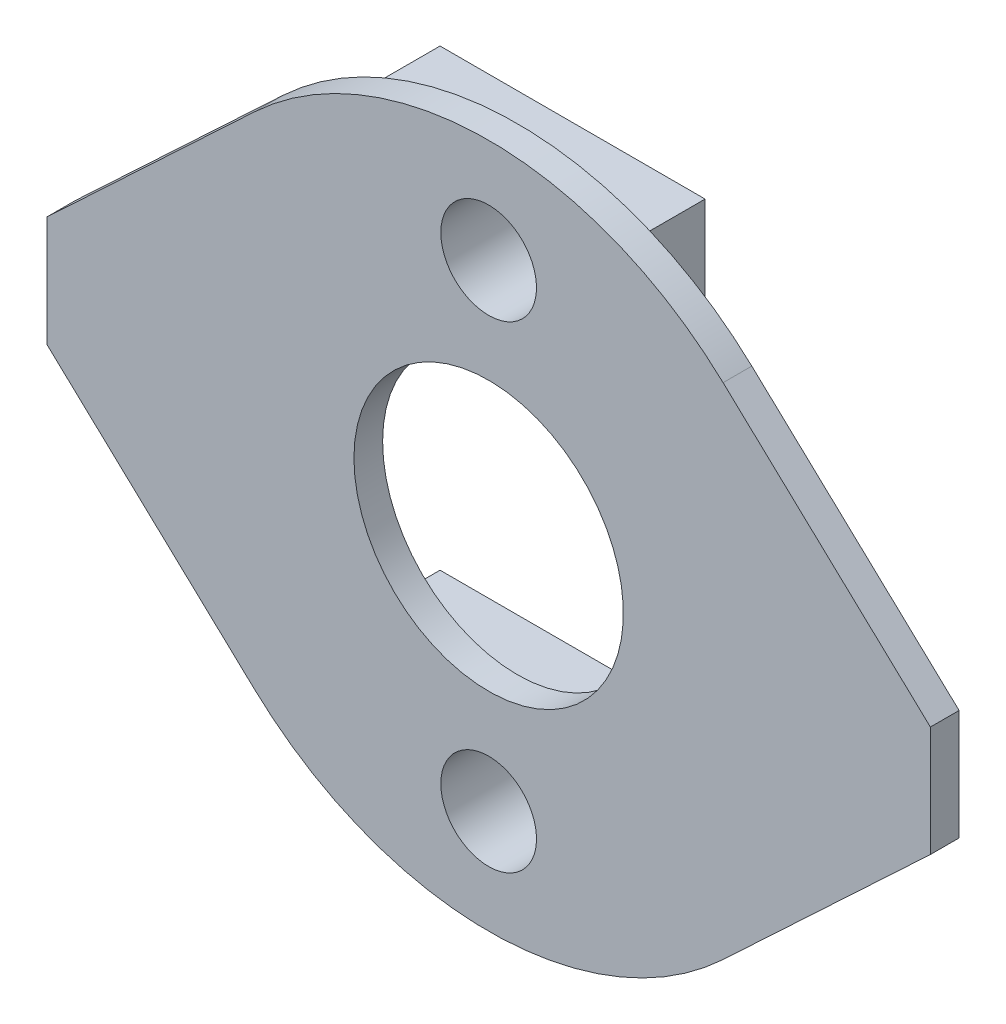
ISO-10303-21;
HEADER;
FILE_DESCRIPTION(('STEP AP214'),'2;1');
FILE_NAME('part.step','',(''),(''),'','','');
FILE_SCHEMA(('AUTOMOTIVE_DESIGN { 1 0 10303 214 1 1 1 1 }'));
ENDSEC;
DATA;
#1=APPLICATION_CONTEXT('core data for automotive mechanical design processes');
#2=APPLICATION_PROTOCOL_DEFINITION('international standard','automotive_design',2000,#1);
#3=PRODUCT_CONTEXT('',#1,'mechanical');
#4=PRODUCT('Part','Part','',(#3));
#5=PRODUCT_RELATED_PRODUCT_CATEGORY('part','',(#4));
#6=PRODUCT_DEFINITION_FORMATION('','',#4);
#7=PRODUCT_DEFINITION_CONTEXT('part definition',#1,'design');
#8=PRODUCT_DEFINITION('design','',#6,#7);
#9=PRODUCT_DEFINITION_SHAPE('','',#8);
#10=(LENGTH_UNIT() NAMED_UNIT(*) SI_UNIT(.MILLI.,.METRE.));
#11=(NAMED_UNIT(*) PLANE_ANGLE_UNIT() SI_UNIT($,.RADIAN.));
#12=(NAMED_UNIT(*) SI_UNIT($,.STERADIAN.) SOLID_ANGLE_UNIT());
#13=UNCERTAINTY_MEASURE_WITH_UNIT(LENGTH_MEASURE(1.E-05),#10,'distance_accuracy_value','');
#14=(GEOMETRIC_REPRESENTATION_CONTEXT(3) GLOBAL_UNCERTAINTY_ASSIGNED_CONTEXT((#13)) GLOBAL_UNIT_ASSIGNED_CONTEXT((#10,
#11,#12)) REPRESENTATION_CONTEXT('',''));
#15=CARTESIAN_POINT('',(0.,0.,0.));
#16=DIRECTION('',(0.,0.,1.));
#17=DIRECTION('',(1.,0.,0.));
#18=AXIS2_PLACEMENT_3D('',#15,#16,#17);
#19=CARTESIAN_POINT('',(0.,0.,0.));
#20=DIRECTION('',(0.,0.,1.));
#21=DIRECTION('',(1.,0.,0.));
#22=AXIS2_PLACEMENT_3D('',#19,#20,#21);
#23=PLANE('',#22);
#24=CARTESIAN_POINT('',(57.1500000000004,9.54764330165096,0.));
#25=DIRECTION('',(0.,0.,1.));
#26=DIRECTION('',(1.,0.,0.));
#27=AXIS2_PLACEMENT_3D('',#24,#25,#26);
#28=CIRCLE('',#27,7.74699999999999);
#29=CARTESIAN_POINT('',(64.8970000000004,9.54764330165096,0.));
#30=VERTEX_POINT('',#29);
#31=EDGE_CURVE('E239',#30,#30,#28,.T.);
#32=ORIENTED_EDGE('',*,*,#31,.T.);
#33=EDGE_LOOP('',(#32));
#34=FACE_BOUND('',#33,.T.);
#35=CARTESIAN_POINT('',(57.1500000000004,9.54764330165096,0.));
#36=DIRECTION('',(0.,0.,1.));
#37=DIRECTION('',(1.,0.,0.));
#38=AXIS2_PLACEMENT_3D('',#35,#36,#37);
#39=CIRCLE('',#38,19.6976671665307);
#40=CARTESIAN_POINT('',(49.5300000000007,27.7117202615029,0.));
#41=VERTEX_POINT('',#40);
#42=CARTESIAN_POINT('',(43.6698010908684,23.9101754312462,0.));
#43=VERTEX_POINT('',#42);
#44=EDGE_CURVE('E257',#41,#43,#39,.T.);
#45=ORIENTED_EDGE('',*,*,#44,.F.);
#46=DIRECTION('',(0.,-1.,0.));
#47=VECTOR('',#46,1.);
#48=CARTESIAN_POINT('',(49.5300000000002,0.,0.));
#49=LINE('',#48,#47);
#50=CARTESIAN_POINT('',(49.5300000000002,17.485143301651,0.));
#51=VERTEX_POINT('',#50);
#52=EDGE_CURVE('E166',#41,#51,#49,.T.);
#53=ORIENTED_EDGE('',*,*,#52,.T.);
#54=DIRECTION('',(-1.,0.,0.));
#55=VECTOR('',#54,1.);
#56=CARTESIAN_POINT('',(0.,17.485143301651,0.));
#57=LINE('',#56,#55);
#58=CARTESIAN_POINT('',(64.7700000000002,17.485143301651,0.));
#59=VERTEX_POINT('',#58);
#60=EDGE_CURVE('E182',#59,#51,#57,.T.);
#61=ORIENTED_EDGE('',*,*,#60,.F.);
#62=DIRECTION('',(0.,-1.,0.));
#63=VECTOR('',#62,1.);
#64=CARTESIAN_POINT('',(64.7700000000002,0.,0.));
#65=LINE('',#64,#63);
#66=CARTESIAN_POINT('',(64.7700000000002,27.7117202615029,0.));
#67=VERTEX_POINT('',#66);
#68=EDGE_CURVE('E199',#67,#59,#65,.T.);
#69=ORIENTED_EDGE('',*,*,#68,.F.);
#70=CARTESIAN_POINT('',(70.6301989091325,23.9101754312462,0.));
#71=VERTEX_POINT('',#70);
#72=EDGE_CURVE('E252',#71,#67,#39,.T.);
#73=ORIENTED_EDGE('',*,*,#72,.F.);
#74=DIRECTION('',(-0.729148888960789,0.684355096223625,0.));
#75=VECTOR('',#74,1.);
#76=CARTESIAN_POINT('',(45.0101814189399,47.9562787720065,0.));
#77=LINE('',#76,#75);
#78=CARTESIAN_POINT('',(82.5500000000005,12.722643301651,0.));
#79=VERTEX_POINT('',#78);
#80=EDGE_CURVE('E258',#79,#71,#77,.T.);
#81=ORIENTED_EDGE('',*,*,#80,.F.);
#82=DIRECTION('',(0.,-1.,0.));
#83=VECTOR('',#82,1.);
#84=CARTESIAN_POINT('',(82.5500000000005,0.,0.));
#85=LINE('',#84,#83);
#86=CARTESIAN_POINT('',(82.5500000000005,6.37264330165097,0.));
#87=VERTEX_POINT('',#86);
#88=EDGE_CURVE('E251',#79,#87,#85,.T.);
#89=ORIENTED_EDGE('',*,*,#88,.T.);
#90=DIRECTION('',(-0.729148888960788,-0.684355096223626,0.));
#91=VECTOR('',#90,1.);
#92=CARTESIAN_POINT('',(35.4816953095491,-37.8041149341407,0.));
#93=LINE('',#92,#91);
#94=CARTESIAN_POINT('',(70.6301989091325,-4.81488882794428,0.));
#95=VERTEX_POINT('',#94);
#96=EDGE_CURVE('E243',#87,#95,#93,.T.);
#97=ORIENTED_EDGE('',*,*,#96,.T.);
#98=CARTESIAN_POINT('',(57.1500000000004,9.54764330165096,0.));
#99=DIRECTION('',(0.,0.,1.));
#100=DIRECTION('',(1.,0.,0.));
#101=AXIS2_PLACEMENT_3D('',#98,#99,#100);
#102=CIRCLE('',#101,19.6976671665307);
#103=CARTESIAN_POINT('',(64.7700000000002,-8.61643365820099,0.));
#104=VERTEX_POINT('',#103);
#105=EDGE_CURVE('E272',#104,#95,#102,.T.);
#106=ORIENTED_EDGE('',*,*,#105,.F.);
#107=DIRECTION('',(0.,1.,0.));
#108=VECTOR('',#107,1.);
#109=CARTESIAN_POINT('',(64.7700000000002,0.,0.));
#110=LINE('',#109,#108);
#111=CARTESIAN_POINT('',(64.7700000000002,1.61014330165096,0.));
#112=VERTEX_POINT('',#111);
#113=EDGE_CURVE('E63',#104,#112,#110,.T.);
#114=ORIENTED_EDGE('',*,*,#113,.T.);
#115=DIRECTION('',(-1.,0.,0.));
#116=VECTOR('',#115,1.);
#117=CARTESIAN_POINT('',(0.,1.61014330165096,0.));
#118=LINE('',#117,#116);
#119=CARTESIAN_POINT('',(49.5300000000002,1.61014330165096,0.));
#120=VERTEX_POINT('',#119);
#121=EDGE_CURVE('E227',#112,#120,#118,.T.);
#122=ORIENTED_EDGE('',*,*,#121,.T.);
#123=DIRECTION('',(0.,1.,0.));
#124=VECTOR('',#123,1.);
#125=CARTESIAN_POINT('',(49.5300000000002,0.,0.));
#126=LINE('',#125,#124);
#127=CARTESIAN_POINT('',(49.5300000000002,-8.61643365820078,0.));
#128=VERTEX_POINT('',#127);
#129=EDGE_CURVE('E224',#128,#120,#126,.T.);
#130=ORIENTED_EDGE('',*,*,#129,.F.);
#131=CARTESIAN_POINT('',(43.6698010908684,-4.81488882794428,0.));
#132=VERTEX_POINT('',#131);
#133=EDGE_CURVE('E267',#132,#128,#102,.T.);
#134=ORIENTED_EDGE('',*,*,#133,.F.);
#135=DIRECTION('',(0.729148888960788,-0.684355096223626,0.));
#136=VECTOR('',#135,1.);
#137=CARTESIAN_POINT('',(18.0497836006758,19.2312145128161,0.));
#138=LINE('',#137,#136);
#139=CARTESIAN_POINT('',(31.7500000000003,6.37264330165096,0.));
#140=VERTEX_POINT('',#139);
#141=EDGE_CURVE('E273',#140,#132,#138,.T.);
#142=ORIENTED_EDGE('',*,*,#141,.F.);
#143=DIRECTION('',(0.,-1.,0.));
#144=VECTOR('',#143,1.);
#145=CARTESIAN_POINT('',(31.7500000000003,1.04083408558609E-13,0.));
#146=LINE('',#145,#144);
#147=CARTESIAN_POINT('',(31.7500000000003,12.722643301651,0.));
#148=VERTEX_POINT('',#147);
#149=EDGE_CURVE('E244',#148,#140,#146,.T.);
#150=ORIENTED_EDGE('',*,*,#149,.F.);
#151=DIRECTION('',(0.729148888960789,0.684355096223625,0.));
#152=VECTOR('',#151,1.);
#153=CARTESIAN_POINT('',(8.52129749128487,-9.07905067495022,0.));
#154=LINE('',#153,#152);
#155=EDGE_CURVE('E247',#148,#43,#154,.T.);
#156=ORIENTED_EDGE('',*,*,#155,.T.);
#157=EDGE_LOOP('',(#45,#53,#61,#69,#73,#81,#89,#97,#106,#114,#122,#130,#134,#142,#150,#156));
#158=FACE_BOUND('',#157,.T.);
#159=ADVANCED_FACE('F46',(#34,#158),#23,.F.);
#160=DIRECTION('',(-1.,0.,0.));
#161=VECTOR('',#160,1.);
#162=CARTESIAN_POINT('',(0.,-8.616433658201,0.));
#163=LINE('',#162,#161);
#164=EDGE_CURVE('E70',#104,#128,#163,.T.);
#165=ORIENTED_EDGE('',*,*,#164,.F.);
#166=EDGE_CURVE('E271',#128,#104,#102,.T.);
#167=ORIENTED_EDGE('',*,*,#166,.F.);
#168=EDGE_LOOP('',(#165,#167));
#169=FACE_BOUND('',#168,.T.);
#170=ADVANCED_FACE('F373',(#169),#23,.F.);
#171=CARTESIAN_POINT('',(18.0497836006758,19.2312145128161,65.9355533320956));
#172=DIRECTION('',(0.684355096223626,0.729148888960788,0.));
#173=DIRECTION('',(-0.729148888960788,0.684355096223626,0.));
#174=AXIS2_PLACEMENT_3D('',#171,#172,#173);
#175=PLANE('',#174);
#176=DIRECTION('',(0.,0.,-1.));
#177=VECTOR('',#176,1.);
#178=CARTESIAN_POINT('',(43.6698010908684,-4.81488882794428,65.9355533320956));
#179=LINE('',#178,#177);
#180=CARTESIAN_POINT('',(43.6698010908684,-4.81488882794428,1.65));
#181=VERTEX_POINT('',#180);
#182=EDGE_CURVE('E278',#181,#132,#179,.T.);
#183=ORIENTED_EDGE('',*,*,#182,.F.);
#184=DIRECTION('',(-0.729148888960788,0.684355096223626,0.));
#185=VECTOR('',#184,1.);
#186=CARTESIAN_POINT('',(18.0497836006758,19.2312145128161,1.65));
#187=LINE('',#186,#185);
#188=CARTESIAN_POINT('',(31.7500000000003,6.37264330165096,1.65));
#189=VERTEX_POINT('',#188);
#190=EDGE_CURVE('E171',#181,#189,#187,.T.);
#191=ORIENTED_EDGE('',*,*,#190,.T.);
#192=DIRECTION('',(0.,0.,-1.));
#193=VECTOR('',#192,1.);
#194=CARTESIAN_POINT('',(31.7500000000003,6.37264330165096,65.9355533320956));
#195=LINE('',#194,#193);
#196=EDGE_CURVE('E277',#189,#140,#195,.T.);
#197=ORIENTED_EDGE('',*,*,#196,.T.);
#198=ORIENTED_EDGE('',*,*,#141,.T.);
#199=EDGE_LOOP('',(#183,#191,#197,#198));
#200=FACE_BOUND('',#199,.T.);
#201=ADVANCED_FACE('F318',(#200),#175,.F.);
#202=CARTESIAN_POINT('',(57.1500000000004,9.54764330165096,65.9355533320956));
#203=DIRECTION('',(0.,0.,-1.));
#204=DIRECTION('',(-1.,0.,0.));
#205=AXIS2_PLACEMENT_3D('',#202,#203,#204);
#206=CYLINDRICAL_SURFACE('',#205,19.6976671665307);
#207=DIRECTION('',(0.,0.,-1.));
#208=VECTOR('',#207,1.);
#209=CARTESIAN_POINT('',(70.6301989091325,-4.81488882794428,65.9355533320956));
#210=LINE('',#209,#208);
#211=CARTESIAN_POINT('',(70.6301989091325,-4.81488882794428,1.65));
#212=VERTEX_POINT('',#211);
#213=EDGE_CURVE('E270',#212,#95,#210,.T.);
#214=ORIENTED_EDGE('',*,*,#213,.F.);
#215=CARTESIAN_POINT('',(57.1500000000004,9.54764330165096,1.65));
#216=DIRECTION('',(0.,0.,-1.));
#217=DIRECTION('',(-1.,0.,0.));
#218=AXIS2_PLACEMENT_3D('',#215,#216,#217);
#219=CIRCLE('',#218,19.6976671665307);
#220=EDGE_CURVE('E276',#212,#181,#219,.T.);
#221=ORIENTED_EDGE('',*,*,#220,.T.);
#222=ORIENTED_EDGE('',*,*,#182,.T.);
#223=ORIENTED_EDGE('',*,*,#133,.T.);
#224=ORIENTED_EDGE('',*,*,#166,.T.);
#225=ORIENTED_EDGE('',*,*,#105,.T.);
#226=EDGE_LOOP('',(#214,#221,#222,#223,#224,#225));
#227=FACE_BOUND('',#226,.T.);
#228=ADVANCED_FACE('F323',(#227),#206,.T.);
#229=CARTESIAN_POINT('',(35.4816953095491,-37.8041149341407,65.9355533320956));
#230=DIRECTION('',(0.684355096223626,-0.729148888960788,0.));
#231=DIRECTION('',(0.729148888960788,0.684355096223626,0.));
#232=AXIS2_PLACEMENT_3D('',#229,#230,#231);
#233=PLANE('',#232);
#234=DIRECTION('',(0.729148888960788,0.684355096223626,0.));
#235=VECTOR('',#234,1.);
#236=CARTESIAN_POINT('',(35.4816953095491,-37.8041149341407,1.65));
#237=LINE('',#236,#235);
#238=CARTESIAN_POINT('',(82.5500000000005,6.37264330165097,1.65));
#239=VERTEX_POINT('',#238);
#240=EDGE_CURVE('E302',#212,#239,#237,.T.);
#241=ORIENTED_EDGE('',*,*,#240,.F.);
#242=ORIENTED_EDGE('',*,*,#213,.T.);
#243=ORIENTED_EDGE('',*,*,#96,.F.);
#244=DIRECTION('',(0.,0.,-1.));
#245=VECTOR('',#244,1.);
#246=CARTESIAN_POINT('',(82.5500000000005,6.37264330165097,65.9355533320956));
#247=LINE('',#246,#245);
#248=EDGE_CURVE('E282',#239,#87,#247,.T.);
#249=ORIENTED_EDGE('',*,*,#248,.F.);
#250=EDGE_LOOP('',(#241,#242,#243,#249));
#251=FACE_BOUND('',#250,.T.);
#252=ADVANCED_FACE('F330',(#251),#233,.T.);
#253=CARTESIAN_POINT('',(82.5500000000005,0.,65.9355533320956));
#254=DIRECTION('',(1.,0.,0.));
#255=DIRECTION('',(0.,0.,-1.));
#256=AXIS2_PLACEMENT_3D('',#253,#254,#255);
#257=PLANE('',#256);
#258=DIRECTION('',(0.,1.,0.));
#259=VECTOR('',#258,1.);
#260=CARTESIAN_POINT('',(82.5500000000005,0.,1.65));
#261=LINE('',#260,#259);
#262=CARTESIAN_POINT('',(82.5500000000005,12.722643301651,1.65));
#263=VERTEX_POINT('',#262);
#264=EDGE_CURVE('E55',#239,#263,#261,.T.);
#265=ORIENTED_EDGE('',*,*,#264,.F.);
#266=ORIENTED_EDGE('',*,*,#248,.T.);
#267=ORIENTED_EDGE('',*,*,#88,.F.);
#268=DIRECTION('',(0.,0.,-1.));
#269=VECTOR('',#268,1.);
#270=CARTESIAN_POINT('',(82.5500000000005,12.722643301651,65.9355533320956));
#271=LINE('',#270,#269);
#272=EDGE_CURVE('E262',#263,#79,#271,.T.);
#273=ORIENTED_EDGE('',*,*,#272,.F.);
#274=EDGE_LOOP('',(#265,#266,#267,#273));
#275=FACE_BOUND('',#274,.T.);
#276=ADVANCED_FACE('F333',(#275),#257,.T.);
#277=CARTESIAN_POINT('',(45.0101814189399,47.9562787720065,65.9355533320956));
#278=DIRECTION('',(-0.684355096223625,-0.729148888960789,0.));
#279=DIRECTION('',(0.729148888960789,-0.684355096223625,0.));
#280=AXIS2_PLACEMENT_3D('',#277,#278,#279);
#281=PLANE('',#280);
#282=DIRECTION('',(0.,0.,-1.));
#283=VECTOR('',#282,1.);
#284=CARTESIAN_POINT('',(70.6301989091325,23.9101754312462,65.9355533320956));
#285=LINE('',#284,#283);
#286=CARTESIAN_POINT('',(70.6301989091325,23.9101754312462,1.65));
#287=VERTEX_POINT('',#286);
#288=EDGE_CURVE('E286',#287,#71,#285,.T.);
#289=ORIENTED_EDGE('',*,*,#288,.F.);
#290=DIRECTION('',(0.729148888960789,-0.684355096223625,0.));
#291=VECTOR('',#290,1.);
#292=CARTESIAN_POINT('',(45.0101814189399,47.9562787720065,1.65));
#293=LINE('',#292,#291);
#294=EDGE_CURVE('E284',#287,#263,#293,.T.);
#295=ORIENTED_EDGE('',*,*,#294,.T.);
#296=ORIENTED_EDGE('',*,*,#272,.T.);
#297=ORIENTED_EDGE('',*,*,#80,.T.);
#298=EDGE_LOOP('',(#289,#295,#296,#297));
#299=FACE_BOUND('',#298,.T.);
#300=ADVANCED_FACE('F337',(#299),#281,.F.);
#301=CARTESIAN_POINT('',(57.1500000000004,9.54764330165096,65.9355533320956));
#302=DIRECTION('',(0.,0.,-1.));
#303=DIRECTION('',(-1.,0.,0.));
#304=AXIS2_PLACEMENT_3D('',#301,#302,#303);
#305=CYLINDRICAL_SURFACE('',#304,19.6976671665307);
#306=DIRECTION('',(0.,0.,-1.));
#307=VECTOR('',#306,1.);
#308=CARTESIAN_POINT('',(43.6698010908684,23.9101754312462,65.9355533320956));
#309=LINE('',#308,#307);
#310=CARTESIAN_POINT('',(43.6698010908684,23.9101754312462,1.65));
#311=VERTEX_POINT('',#310);
#312=EDGE_CURVE('E255',#311,#43,#309,.T.);
#313=ORIENTED_EDGE('',*,*,#312,.F.);
#314=CARTESIAN_POINT('',(57.1500000000004,9.54764330165096,1.65));
#315=DIRECTION('',(0.,0.,-1.));
#316=DIRECTION('',(-1.,0.,0.));
#317=AXIS2_PLACEMENT_3D('',#314,#315,#316);
#318=CIRCLE('',#317,19.6976671665307);
#319=EDGE_CURVE('E261',#311,#287,#318,.T.);
#320=ORIENTED_EDGE('',*,*,#319,.T.);
#321=ORIENTED_EDGE('',*,*,#288,.T.);
#322=ORIENTED_EDGE('',*,*,#72,.T.);
#323=EDGE_CURVE('E256',#67,#41,#39,.T.);
#324=ORIENTED_EDGE('',*,*,#323,.T.);
#325=ORIENTED_EDGE('',*,*,#44,.T.);
#326=EDGE_LOOP('',(#313,#320,#321,#322,#324,#325));
#327=FACE_BOUND('',#326,.T.);
#328=ADVANCED_FACE('F340',(#327),#305,.T.);
#329=CARTESIAN_POINT('',(8.52129749128487,-9.07905067495022,65.9355533320956));
#330=DIRECTION('',(-0.684355096223625,0.729148888960789,0.));
#331=DIRECTION('',(-0.729148888960789,-0.684355096223625,0.));
#332=AXIS2_PLACEMENT_3D('',#329,#330,#331);
#333=PLANE('',#332);
#334=DIRECTION('',(-0.729148888960789,-0.684355096223625,0.));
#335=VECTOR('',#334,1.);
#336=CARTESIAN_POINT('',(8.52129749128487,-9.07905067495022,1.65));
#337=LINE('',#336,#335);
#338=CARTESIAN_POINT('',(31.7500000000003,12.722643301651,1.65));
#339=VERTEX_POINT('',#338);
#340=EDGE_CURVE('E12',#311,#339,#337,.T.);
#341=ORIENTED_EDGE('',*,*,#340,.F.);
#342=ORIENTED_EDGE('',*,*,#312,.T.);
#343=ORIENTED_EDGE('',*,*,#155,.F.);
#344=DIRECTION('',(0.,0.,-1.));
#345=VECTOR('',#344,1.);
#346=CARTESIAN_POINT('',(31.7500000000003,12.722643301651,65.9355533320956));
#347=LINE('',#346,#345);
#348=EDGE_CURVE('E248',#339,#148,#347,.T.);
#349=ORIENTED_EDGE('',*,*,#348,.F.);
#350=EDGE_LOOP('',(#341,#342,#343,#349));
#351=FACE_BOUND('',#350,.T.);
#352=ADVANCED_FACE('F345',(#351),#333,.T.);
#353=CARTESIAN_POINT('',(57.1500000000004,-4.17469028161438,65.9355533320956));
#354=DIRECTION('',(0.,0.,-1.));
#355=DIRECTION('',(-1.,0.,0.));
#356=AXIS2_PLACEMENT_3D('',#353,#354,#355);
#357=CYLINDRICAL_SURFACE('',#356,2.75000000000021);
#358=CARTESIAN_POINT('',(57.1500000000004,-4.17469028161438,1.65));
#359=DIRECTION('',(0.,0.,-1.));
#360=DIRECTION('',(-1.,0.,0.));
#361=AXIS2_PLACEMENT_3D('',#358,#359,#360);
#362=CIRCLE('',#361,2.75000000000021);
#363=CARTESIAN_POINT('',(54.4000000000002,-4.17469028161438,1.65));
#364=VERTEX_POINT('',#363);
#365=EDGE_CURVE('E242',#364,#364,#362,.T.);
#366=ORIENTED_EDGE('',*,*,#365,.F.);
#367=EDGE_LOOP('',(#366));
#368=FACE_BOUND('',#367,.T.);
#369=CARTESIAN_POINT('',(57.1500000000004,-4.17469028161438,-3.175));
#370=DIRECTION('',(0.,0.,-1.));
#371=DIRECTION('',(-1.,0.,0.));
#372=AXIS2_PLACEMENT_3D('',#369,#370,#371);
#373=CIRCLE('',#372,2.75000000000021);
#374=CARTESIAN_POINT('',(54.4000000000002,-4.17469028161438,-3.175));
#375=VERTEX_POINT('',#374);
#376=EDGE_CURVE('E208',#375,#375,#373,.F.);
#377=ORIENTED_EDGE('',*,*,#376,.F.);
#378=EDGE_LOOP('',(#377));
#379=FACE_BOUND('',#378,.T.);
#380=ADVANCED_FACE('F510',(#368,#379),#357,.F.);
#381=CARTESIAN_POINT('',(57.1500000000004,9.54764330165096,65.9355533320956));
#382=DIRECTION('',(0.,0.,-1.));
#383=DIRECTION('',(-1.,0.,0.));
#384=AXIS2_PLACEMENT_3D('',#381,#382,#383);
#385=CYLINDRICAL_SURFACE('',#384,7.74699999999999);
#386=CARTESIAN_POINT('',(57.1500000000004,9.54764330165096,1.65));
#387=DIRECTION('',(0.,0.,-1.));
#388=DIRECTION('',(-1.,0.,0.));
#389=AXIS2_PLACEMENT_3D('',#386,#387,#388);
#390=CIRCLE('',#389,7.74699999999999);
#391=CARTESIAN_POINT('',(49.4030000000004,9.54764330165096,1.65));
#392=VERTEX_POINT('',#391);
#393=EDGE_CURVE('E295',#392,#392,#390,.T.);
#394=ORIENTED_EDGE('',*,*,#393,.F.);
#395=EDGE_LOOP('',(#394));
#396=FACE_BOUND('',#395,.T.);
#397=ORIENTED_EDGE('',*,*,#31,.F.);
#398=EDGE_LOOP('',(#397));
#399=FACE_BOUND('',#398,.T.);
#400=ADVANCED_FACE('F502',(#396,#399),#385,.F.);
#401=CARTESIAN_POINT('',(31.7500000000003,1.04083408558609E-13,65.9355533320956));
#402=DIRECTION('',(1.,0.,0.));
#403=DIRECTION('',(0.,1.,0.));
#404=AXIS2_PLACEMENT_3D('',#401,#402,#403);
#405=PLANE('',#404);
#406=ORIENTED_EDGE('',*,*,#196,.F.);
#407=DIRECTION('',(0.,1.,0.));
#408=VECTOR('',#407,1.);
#409=CARTESIAN_POINT('',(31.7500000000003,1.04083408558609E-13,1.65));
#410=LINE('',#409,#408);
#411=EDGE_CURVE('E290',#189,#339,#410,.T.);
#412=ORIENTED_EDGE('',*,*,#411,.T.);
#413=ORIENTED_EDGE('',*,*,#348,.T.);
#414=ORIENTED_EDGE('',*,*,#149,.T.);
#415=EDGE_LOOP('',(#406,#412,#413,#414));
#416=FACE_BOUND('',#415,.T.);
#417=ADVANCED_FACE('F311',(#416),#405,.F.);
#418=CARTESIAN_POINT('',(57.1500000000004,23.2699768849163,65.9355533320956));
#419=DIRECTION('',(0.,0.,-1.));
#420=DIRECTION('',(-1.,0.,0.));
#421=AXIS2_PLACEMENT_3D('',#418,#419,#420);
#422=CYLINDRICAL_SURFACE('',#421,2.75000000000021);
#423=CARTESIAN_POINT('',(57.1500000000004,23.2699768849163,1.65));
#424=DIRECTION('',(0.,0.,-1.));
#425=DIRECTION('',(-1.,0.,0.));
#426=AXIS2_PLACEMENT_3D('',#423,#424,#425);
#427=CIRCLE('',#426,2.75000000000021);
#428=CARTESIAN_POINT('',(54.4000000000002,23.2699768849163,1.65));
#429=VERTEX_POINT('',#428);
#430=EDGE_CURVE('E50',#429,#429,#427,.T.);
#431=ORIENTED_EDGE('',*,*,#430,.F.);
#432=EDGE_LOOP('',(#431));
#433=FACE_BOUND('',#432,.T.);
#434=CARTESIAN_POINT('',(57.1500000000004,23.2699768849163,-3.175));
#435=DIRECTION('',(0.,0.,-1.));
#436=DIRECTION('',(-1.,0.,0.));
#437=AXIS2_PLACEMENT_3D('',#434,#435,#436);
#438=CIRCLE('',#437,2.75000000000021);
#439=CARTESIAN_POINT('',(54.4000000000002,23.2699768849163,-3.175));
#440=VERTEX_POINT('',#439);
#441=EDGE_CURVE('E191',#440,#440,#438,.F.);
#442=ORIENTED_EDGE('',*,*,#441,.F.);
#443=EDGE_LOOP('',(#442));
#444=FACE_BOUND('',#443,.T.);
#445=ADVANCED_FACE('F384',(#433,#444),#422,.F.);
#446=ORIENTED_EDGE('',*,*,#323,.F.);
#447=DIRECTION('',(-1.,0.,0.));
#448=VECTOR('',#447,1.);
#449=CARTESIAN_POINT('',(0.,27.7117202615029,0.));
#450=LINE('',#449,#448);
#451=EDGE_CURVE('E196',#67,#41,#450,.T.);
#452=ORIENTED_EDGE('',*,*,#451,.T.);
#453=EDGE_LOOP('',(#446,#452));
#454=FACE_BOUND('',#453,.T.);
#455=ADVANCED_FACE('F376',(#454),#23,.F.);
#456=CARTESIAN_POINT('',(12.7,133.35,1.65));
#457=DIRECTION('',(0.,0.,-1.));
#458=DIRECTION('',(-1.,0.,0.));
#459=AXIS2_PLACEMENT_3D('',#456,#457,#458);
#460=PLANE('',#459);
#461=ORIENTED_EDGE('',*,*,#365,.T.);
#462=EDGE_LOOP('',(#461));
#463=FACE_BOUND('',#462,.T.);
#464=ORIENTED_EDGE('',*,*,#393,.T.);
#465=EDGE_LOOP('',(#464));
#466=FACE_BOUND('',#465,.T.);
#467=ORIENTED_EDGE('',*,*,#430,.T.);
#468=EDGE_LOOP('',(#467));
#469=FACE_BOUND('',#468,.T.);
#470=ORIENTED_EDGE('',*,*,#220,.F.);
#471=ORIENTED_EDGE('',*,*,#240,.T.);
#472=ORIENTED_EDGE('',*,*,#264,.T.);
#473=ORIENTED_EDGE('',*,*,#294,.F.);
#474=ORIENTED_EDGE('',*,*,#319,.F.);
#475=ORIENTED_EDGE('',*,*,#340,.T.);
#476=ORIENTED_EDGE('',*,*,#411,.F.);
#477=ORIENTED_EDGE('',*,*,#190,.F.);
#478=EDGE_LOOP('',(#470,#471,#472,#473,#474,#475,#476,#477));
#479=FACE_BOUND('',#478,.T.);
#480=ADVANCED_FACE('F48',(#463,#466,#469,#479),#460,.F.);
#481=CARTESIAN_POINT('',(0.,-8.616433658201,-3.175));
#482=DIRECTION('',(0.,1.,0.));
#483=DIRECTION('',(0.,0.,1.));
#484=AXIS2_PLACEMENT_3D('',#481,#482,#483);
#485=PLANE('',#484);
#486=ORIENTED_EDGE('',*,*,#164,.T.);
#487=DIRECTION('',(0.,0.,1.));
#488=VECTOR('',#487,1.);
#489=CARTESIAN_POINT('',(49.5300000000007,-8.616433658201,-3.175));
#490=LINE('',#489,#488);
#491=CARTESIAN_POINT('',(49.5300000000007,-8.616433658201,-3.175));
#492=VERTEX_POINT('',#491);
#493=EDGE_CURVE('E197',#492,#128,#490,.T.);
#494=ORIENTED_EDGE('',*,*,#493,.F.);
#495=DIRECTION('',(-1.,0.,0.));
#496=VECTOR('',#495,1.);
#497=CARTESIAN_POINT('',(0.,-8.616433658201,-3.175));
#498=LINE('',#497,#496);
#499=CARTESIAN_POINT('',(64.7700000000002,-8.616433658201,-3.175));
#500=VERTEX_POINT('',#499);
#501=EDGE_CURVE('E211',#500,#492,#498,.T.);
#502=ORIENTED_EDGE('',*,*,#501,.F.);
#503=DIRECTION('',(0.,0.,1.));
#504=VECTOR('',#503,1.);
#505=CARTESIAN_POINT('',(64.7700000000002,-8.616433658201,-3.175));
#506=LINE('',#505,#504);
#507=EDGE_CURVE('E222',#500,#104,#506,.T.);
#508=ORIENTED_EDGE('',*,*,#507,.T.);
#509=EDGE_LOOP('',(#486,#494,#502,#508));
#510=FACE_BOUND('',#509,.T.);
#511=ADVANCED_FACE('F353',(#510),#485,.F.);
#512=CARTESIAN_POINT('',(49.5300000000002,0.,-3.175));
#513=DIRECTION('',(1.,0.,0.));
#514=DIRECTION('',(0.,0.,-1.));
#515=AXIS2_PLACEMENT_3D('',#512,#513,#514);
#516=PLANE('',#515);
#517=ORIENTED_EDGE('',*,*,#129,.T.);
#518=DIRECTION('',(0.,0.,1.));
#519=VECTOR('',#518,1.);
#520=CARTESIAN_POINT('',(49.5300000000002,1.61014330165096,-3.175));
#521=LINE('',#520,#519);
#522=CARTESIAN_POINT('',(49.5300000000002,1.61014330165096,-3.175));
#523=VERTEX_POINT('',#522);
#524=EDGE_CURVE('E234',#523,#120,#521,.T.);
#525=ORIENTED_EDGE('',*,*,#524,.F.);
#526=DIRECTION('',(0.,1.,0.));
#527=VECTOR('',#526,1.);
#528=CARTESIAN_POINT('',(49.5300000000002,0.,-3.175));
#529=LINE('',#528,#527);
#530=EDGE_CURVE('E214',#492,#523,#529,.T.);
#531=ORIENTED_EDGE('',*,*,#530,.F.);
#532=ORIENTED_EDGE('',*,*,#493,.T.);
#533=EDGE_LOOP('',(#517,#525,#531,#532));
#534=FACE_BOUND('',#533,.T.);
#535=ADVANCED_FACE('F349',(#534),#516,.F.);
#536=CARTESIAN_POINT('',(0.,1.61014330165096,-3.175));
#537=DIRECTION('',(0.,1.,0.));
#538=DIRECTION('',(0.,0.,1.));
#539=AXIS2_PLACEMENT_3D('',#536,#537,#538);
#540=PLANE('',#539);
#541=ORIENTED_EDGE('',*,*,#121,.F.);
#542=DIRECTION('',(0.,0.,1.));
#543=VECTOR('',#542,1.);
#544=CARTESIAN_POINT('',(64.7700000000002,1.61014330165096,-3.175));
#545=LINE('',#544,#543);
#546=CARTESIAN_POINT('',(64.7700000000002,1.61014330165096,-3.175));
#547=VERTEX_POINT('',#546);
#548=EDGE_CURVE('E232',#547,#112,#545,.T.);
#549=ORIENTED_EDGE('',*,*,#548,.F.);
#550=DIRECTION('',(-1.,0.,0.));
#551=VECTOR('',#550,1.);
#552=CARTESIAN_POINT('',(0.,1.61014330165096,-3.175));
#553=LINE('',#552,#551);
#554=EDGE_CURVE('E216',#547,#523,#553,.T.);
#555=ORIENTED_EDGE('',*,*,#554,.T.);
#556=ORIENTED_EDGE('',*,*,#524,.T.);
#557=EDGE_LOOP('',(#541,#549,#555,#556));
#558=FACE_BOUND('',#557,.T.);
#559=ADVANCED_FACE('F360',(#558),#540,.T.);
#560=CARTESIAN_POINT('',(64.7700000000002,0.,-3.175));
#561=DIRECTION('',(1.,0.,0.));
#562=DIRECTION('',(0.,0.,-1.));
#563=AXIS2_PLACEMENT_3D('',#560,#561,#562);
#564=PLANE('',#563);
#565=ORIENTED_EDGE('',*,*,#113,.F.);
#566=ORIENTED_EDGE('',*,*,#507,.F.);
#567=DIRECTION('',(0.,1.,0.));
#568=VECTOR('',#567,1.);
#569=CARTESIAN_POINT('',(64.7700000000002,0.,-3.175));
#570=LINE('',#569,#568);
#571=EDGE_CURVE('E219',#500,#547,#570,.T.);
#572=ORIENTED_EDGE('',*,*,#571,.T.);
#573=ORIENTED_EDGE('',*,*,#548,.T.);
#574=EDGE_LOOP('',(#565,#566,#572,#573));
#575=FACE_BOUND('',#574,.T.);
#576=ADVANCED_FACE('F356',(#575),#564,.T.);
#577=CARTESIAN_POINT('',(0.,0.,-3.175));
#578=DIRECTION('',(0.,0.,-1.));
#579=DIRECTION('',(-1.,0.,0.));
#580=AXIS2_PLACEMENT_3D('',#577,#578,#579);
#581=PLANE('',#580);
#582=ORIENTED_EDGE('',*,*,#376,.T.);
#583=EDGE_LOOP('',(#582));
#584=FACE_BOUND('',#583,.T.);
#585=ORIENTED_EDGE('',*,*,#501,.T.);
#586=ORIENTED_EDGE('',*,*,#530,.T.);
#587=ORIENTED_EDGE('',*,*,#554,.F.);
#588=ORIENTED_EDGE('',*,*,#571,.F.);
#589=EDGE_LOOP('',(#585,#586,#587,#588));
#590=FACE_BOUND('',#589,.T.);
#591=ADVANCED_FACE('F362',(#584,#590),#581,.T.);
#592=CARTESIAN_POINT('',(49.5300000000002,0.,-3.175));
#593=DIRECTION('',(-1.,0.,0.));
#594=DIRECTION('',(0.,0.,1.));
#595=AXIS2_PLACEMENT_3D('',#592,#593,#594);
#596=PLANE('',#595);
#597=ORIENTED_EDGE('',*,*,#52,.F.);
#598=DIRECTION('',(0.,0.,1.));
#599=VECTOR('',#598,1.);
#600=CARTESIAN_POINT('',(49.5300000000007,27.7117202615029,-3.175));
#601=LINE('',#600,#599);
#602=CARTESIAN_POINT('',(49.5300000000007,27.7117202615029,-3.175));
#603=VERTEX_POINT('',#602);
#604=EDGE_CURVE('E161',#603,#41,#601,.T.);
#605=ORIENTED_EDGE('',*,*,#604,.F.);
#606=DIRECTION('',(0.,-1.,0.));
#607=VECTOR('',#606,1.);
#608=CARTESIAN_POINT('',(49.5300000000002,0.,-3.175));
#609=LINE('',#608,#607);
#610=CARTESIAN_POINT('',(49.5300000000002,17.485143301651,-3.175));
#611=VERTEX_POINT('',#610);
#612=EDGE_CURVE('E164',#603,#611,#609,.T.);
#613=ORIENTED_EDGE('',*,*,#612,.T.);
#614=DIRECTION('',(0.,0.,1.));
#615=VECTOR('',#614,1.);
#616=CARTESIAN_POINT('',(49.5300000000002,17.485143301651,-3.175));
#617=LINE('',#616,#615);
#618=EDGE_CURVE('E194',#611,#51,#617,.T.);
#619=ORIENTED_EDGE('',*,*,#618,.T.);
#620=EDGE_LOOP('',(#597,#605,#613,#619));
#621=FACE_BOUND('',#620,.T.);
#622=ADVANCED_FACE('F163',(#621),#596,.T.);
#623=CARTESIAN_POINT('',(0.,27.7117202615029,-3.175));
#624=DIRECTION('',(0.,1.,0.));
#625=DIRECTION('',(0.,0.,1.));
#626=AXIS2_PLACEMENT_3D('',#623,#624,#625);
#627=PLANE('',#626);
#628=ORIENTED_EDGE('',*,*,#451,.F.);
#629=DIRECTION('',(0.,0.,1.));
#630=VECTOR('',#629,1.);
#631=CARTESIAN_POINT('',(64.7700000000002,27.7117202615029,-3.175));
#632=LINE('',#631,#630);
#633=CARTESIAN_POINT('',(64.7700000000002,27.7117202615029,-3.175));
#634=VERTEX_POINT('',#633);
#635=EDGE_CURVE('E172',#634,#67,#632,.T.);
#636=ORIENTED_EDGE('',*,*,#635,.F.);
#637=DIRECTION('',(-1.,0.,0.));
#638=VECTOR('',#637,1.);
#639=CARTESIAN_POINT('',(0.,27.7117202615029,-3.175));
#640=LINE('',#639,#638);
#641=EDGE_CURVE('E178',#634,#603,#640,.T.);
#642=ORIENTED_EDGE('',*,*,#641,.T.);
#643=ORIENTED_EDGE('',*,*,#604,.T.);
#644=EDGE_LOOP('',(#628,#636,#642,#643));
#645=FACE_BOUND('',#644,.T.);
#646=ADVANCED_FACE('F184',(#645),#627,.T.);
#647=CARTESIAN_POINT('',(64.7700000000002,0.,-3.175));
#648=DIRECTION('',(-1.,0.,0.));
#649=DIRECTION('',(0.,-1.,0.));
#650=AXIS2_PLACEMENT_3D('',#647,#648,#649);
#651=PLANE('',#650);
#652=ORIENTED_EDGE('',*,*,#68,.T.);
#653=DIRECTION('',(0.,0.,1.));
#654=VECTOR('',#653,1.);
#655=CARTESIAN_POINT('',(64.7700000000002,17.485143301651,-3.175));
#656=LINE('',#655,#654);
#657=CARTESIAN_POINT('',(64.7700000000002,17.485143301651,-3.175));
#658=VERTEX_POINT('',#657);
#659=EDGE_CURVE('E204',#658,#59,#656,.T.);
#660=ORIENTED_EDGE('',*,*,#659,.F.);
#661=DIRECTION('',(0.,-1.,0.));
#662=VECTOR('',#661,1.);
#663=CARTESIAN_POINT('',(64.7700000000002,0.,-3.175));
#664=LINE('',#663,#662);
#665=EDGE_CURVE('E186',#634,#658,#664,.T.);
#666=ORIENTED_EDGE('',*,*,#665,.F.);
#667=ORIENTED_EDGE('',*,*,#635,.T.);
#668=EDGE_LOOP('',(#652,#660,#666,#667));
#669=FACE_BOUND('',#668,.T.);
#670=ADVANCED_FACE('F398',(#669),#651,.F.);
#671=CARTESIAN_POINT('',(0.,17.485143301651,-3.175));
#672=DIRECTION('',(0.,1.,0.));
#673=DIRECTION('',(0.,0.,1.));
#674=AXIS2_PLACEMENT_3D('',#671,#672,#673);
#675=PLANE('',#674);
#676=ORIENTED_EDGE('',*,*,#60,.T.);
#677=ORIENTED_EDGE('',*,*,#618,.F.);
#678=DIRECTION('',(-1.,0.,0.));
#679=VECTOR('',#678,1.);
#680=CARTESIAN_POINT('',(0.,17.485143301651,-3.175));
#681=LINE('',#680,#679);
#682=EDGE_CURVE('E180',#658,#611,#681,.T.);
#683=ORIENTED_EDGE('',*,*,#682,.F.);
#684=ORIENTED_EDGE('',*,*,#659,.T.);
#685=EDGE_LOOP('',(#676,#677,#683,#684));
#686=FACE_BOUND('',#685,.T.);
#687=ADVANCED_FACE('F400',(#686),#675,.F.);
#688=CARTESIAN_POINT('',(0.,0.,-3.175));
#689=DIRECTION('',(0.,0.,-1.));
#690=DIRECTION('',(-1.,0.,0.));
#691=AXIS2_PLACEMENT_3D('',#688,#689,#690);
#692=PLANE('',#691);
#693=ORIENTED_EDGE('',*,*,#612,.F.);
#694=ORIENTED_EDGE('',*,*,#641,.F.);
#695=ORIENTED_EDGE('',*,*,#665,.T.);
#696=ORIENTED_EDGE('',*,*,#682,.T.);
#697=EDGE_LOOP('',(#693,#694,#695,#696));
#698=FACE_BOUND('',#697,.T.);
#699=ORIENTED_EDGE('',*,*,#441,.T.);
#700=EDGE_LOOP('',(#699));
#701=FACE_BOUND('',#700,.T.);
#702=ADVANCED_FACE('F176',(#698,#701),#692,.T.);
#703=CLOSED_SHELL('',(#159,#170,#201,#228,#252,#276,#300,#328,#352,#380,#400,#417,#445,#455,
#480,#511,#535,#559,#576,#591,#622,#646,#670,#687,#702));
#704=MANIFOLD_SOLID_BREP('B2',#703);
#705=ADVANCED_BREP_SHAPE_REPRESENTATION('',(#18,#704),#14);
#706=SHAPE_DEFINITION_REPRESENTATION(#9,#705);
ENDSEC;
END-ISO-10303-21;
